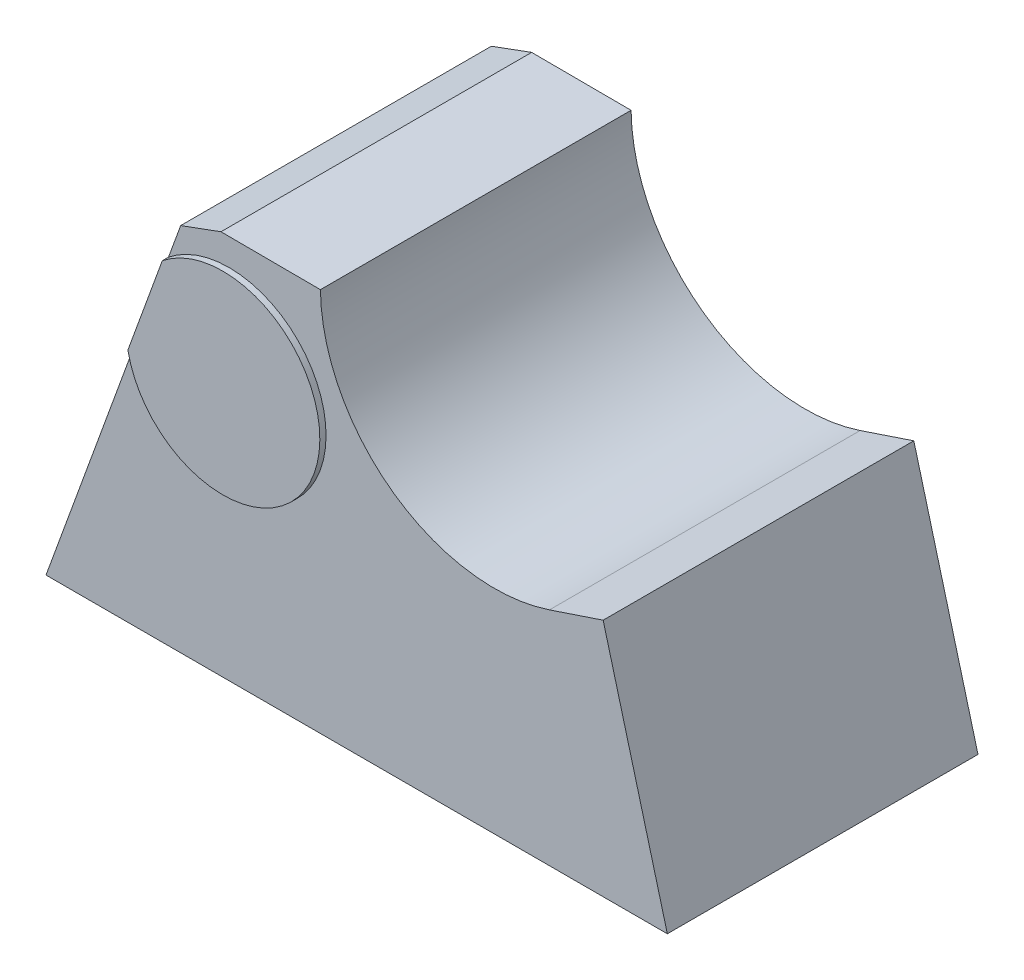
ISO-10303-21;
HEADER;
FILE_DESCRIPTION(('STEP AP214'),'2;1');
FILE_NAME('part.step','',(''),(''),'','','');
FILE_SCHEMA(('AUTOMOTIVE_DESIGN { 1 0 10303 214 1 1 1 1 }'));
ENDSEC;
DATA;
#1=APPLICATION_CONTEXT('core data for automotive mechanical design processes');
#2=APPLICATION_PROTOCOL_DEFINITION('international standard','automotive_design',2000,#1);
#3=PRODUCT_CONTEXT('',#1,'mechanical');
#4=PRODUCT('Part','Part','',(#3));
#5=PRODUCT_RELATED_PRODUCT_CATEGORY('part','',(#4));
#6=PRODUCT_DEFINITION_FORMATION('','',#4);
#7=PRODUCT_DEFINITION_CONTEXT('part definition',#1,'design');
#8=PRODUCT_DEFINITION('design','',#6,#7);
#9=PRODUCT_DEFINITION_SHAPE('','',#8);
#10=(LENGTH_UNIT() NAMED_UNIT(*) SI_UNIT(.MILLI.,.METRE.));
#11=(NAMED_UNIT(*) PLANE_ANGLE_UNIT() SI_UNIT($,.RADIAN.));
#12=(NAMED_UNIT(*) SI_UNIT($,.STERADIAN.) SOLID_ANGLE_UNIT());
#13=UNCERTAINTY_MEASURE_WITH_UNIT(LENGTH_MEASURE(1.E-05),#10,'distance_accuracy_value','');
#14=(GEOMETRIC_REPRESENTATION_CONTEXT(3) GLOBAL_UNCERTAINTY_ASSIGNED_CONTEXT((#13)) GLOBAL_UNIT_ASSIGNED_CONTEXT((#10,
#11,#12)) REPRESENTATION_CONTEXT('',''));
#15=CARTESIAN_POINT('',(0.,0.,0.));
#16=DIRECTION('',(0.,0.,1.));
#17=DIRECTION('',(1.,0.,0.));
#18=AXIS2_PLACEMENT_3D('',#15,#16,#17);
#19=CARTESIAN_POINT('',(360.804093968481,53.1162684441263,0.));
#20=DIRECTION('',(0.,0.,-1.));
#21=DIRECTION('',(-1.,0.,0.));
#22=AXIS2_PLACEMENT_3D('',#19,#20,#21);
#23=PLANE('',#22);
#24=DIRECTION('',(0.34202014332567,0.939692620785908,0.));
#25=VECTOR('',#24,1.);
#26=CARTESIAN_POINT('',(142.196902628573,132.68277908839,0.));
#27=LINE('',#26,#25);
#28=CARTESIAN_POINT('',(0.,-258.,0.));
#29=VERTEX_POINT('',#28);
#30=CARTESIAN_POINT('',(70.877250349026,-63.2663551130197,0.));
#31=VERTEX_POINT('',#30);
#32=EDGE_CURVE('E136',#29,#31,#27,.T.);
#33=ORIENTED_EDGE('',*,*,#32,.F.);
#34=DIRECTION('',(1.,0.,0.));
#35=VECTOR('',#34,1.);
#36=CARTESIAN_POINT('',(0.,-258.,0.));
#37=LINE('',#36,#35);
#38=CARTESIAN_POINT('',(500.,-258.,0.));
#39=VERTEX_POINT('',#38);
#40=EDGE_CURVE('E150',#29,#39,#37,.T.);
#41=ORIENTED_EDGE('',*,*,#40,.T.);
#42=DIRECTION('',(-0.258819045102521,0.965925826289068,0.));
#43=VECTOR('',#42,1.);
#44=CARTESIAN_POINT('',(412.896575236252,67.0744067315589,0.));
#45=LINE('',#44,#43);
#46=CARTESIAN_POINT('',(448.352137529273,-65.2475531569163,0.));
#47=VERTEX_POINT('',#46);
#48=EDGE_CURVE('E194',#39,#47,#45,.T.);
#49=ORIENTED_EDGE('',*,*,#48,.T.);
#50=DIRECTION('',(-0.948509060315187,-0.31675,0.));
#51=VECTOR('',#50,1.);
#52=CARTESIAN_POINT('',(500.,-48.,0.));
#53=LINE('',#52,#51);
#54=CARTESIAN_POINT('',(405.149093968481,-79.675,0.));
#55=VERTEX_POINT('',#54);
#56=EDGE_CURVE('E158',#47,#55,#53,.T.);
#57=ORIENTED_EDGE('',*,*,#56,.T.);
#58=CARTESIAN_POINT('',(360.804093968481,53.1162684441263,0.));
#59=DIRECTION('',(0.,0.,-1.));
#60=DIRECTION('',(-1.,0.,0.));
#61=AXIS2_PLACEMENT_3D('',#58,#59,#60);
#62=CIRCLE('',#61,140.);
#63=CARTESIAN_POINT('',(220.815553875511,51.325,0.));
#64=VERTEX_POINT('',#63);
#65=EDGE_CURVE('E161',#55,#64,#62,.T.);
#66=ORIENTED_EDGE('',*,*,#65,.T.);
#67=DIRECTION('',(-0.99999018839045,0.00442979941225365,0.));
#68=VECTOR('',#67,1.);
#69=CARTESIAN_POINT('',(220.815553875511,51.325,0.));
#70=LINE('',#69,#68);
#71=CARTESIAN_POINT('',(140.816338804275,51.6793839529803,0.));
#72=VERTEX_POINT('',#71);
#73=EDGE_CURVE('E170',#64,#72,#70,.T.);
#74=ORIENTED_EDGE('',*,*,#73,.T.);
#75=DIRECTION('',(-0.938775592028502,-0.344529226353202,0.));
#76=VECTOR('',#75,1.);
#77=CARTESIAN_POINT('',(140.816338804275,51.6793839529803,0.));
#78=LINE('',#77,#76);
#79=CARTESIAN_POINT('',(108.381551710386,39.7758660097388,0.));
#80=VERTEX_POINT('',#79);
#81=EDGE_CURVE('E159',#72,#80,#78,.T.);
#82=ORIENTED_EDGE('',*,*,#81,.T.);
#83=CARTESIAN_POINT('',(98.5951281439417,12.8878882437137,0.));
#84=VERTEX_POINT('',#83);
#85=EDGE_CURVE('E154',#84,#80,#27,.T.);
#86=ORIENTED_EDGE('',*,*,#85,.F.);
#87=CARTESIAN_POINT('',(147.365575325694,-47.9844657578517,0.));
#88=DIRECTION('',(0.,0.,-1.));
#89=DIRECTION('',(-1.,0.,0.));
#90=AXIS2_PLACEMENT_3D('',#87,#88,#89);
#91=CIRCLE('',#90,78.);
#92=EDGE_CURVE('E153',#31,#84,#91,.F.);
#93=ORIENTED_EDGE('',*,*,#92,.F.);
#94=EDGE_LOOP('',(#33,#41,#49,#57,#66,#74,#82,#86,#93));
#95=FACE_BOUND('',#94,.T.);
#96=ADVANCED_FACE('F39',(#95),#23,.F.);
#97=CARTESIAN_POINT('',(140.816338804275,51.6793839529803,-250.));
#98=DIRECTION('',(-0.344529226353202,0.938775592028502,0.));
#99=DIRECTION('',(-0.938775592028502,-0.344529226353202,0.));
#100=AXIS2_PLACEMENT_3D('',#97,#98,#99);
#101=PLANE('',#100);
#102=DIRECTION('',(-0.938775592028502,-0.344529226353202,0.));
#103=VECTOR('',#102,1.);
#104=CARTESIAN_POINT('',(140.816338804275,51.6793839529803,-250.));
#105=LINE('',#104,#103);
#106=CARTESIAN_POINT('',(140.816338804275,51.6793839529803,-250.));
#107=VERTEX_POINT('',#106);
#108=CARTESIAN_POINT('',(108.381551710386,39.7758660097388,-250.));
#109=VERTEX_POINT('',#108);
#110=EDGE_CURVE('E173',#107,#109,#105,.T.);
#111=ORIENTED_EDGE('',*,*,#110,.T.);
#112=DIRECTION('',(0.,0.,-1.));
#113=VECTOR('',#112,1.);
#114=CARTESIAN_POINT('',(108.381551710386,39.7758660097388,8.00000000000001));
#115=LINE('',#114,#113);
#116=EDGE_CURVE('E256',#80,#109,#115,.T.);
#117=ORIENTED_EDGE('',*,*,#116,.F.);
#118=ORIENTED_EDGE('',*,*,#81,.F.);
#119=DIRECTION('',(0.,0.,1.));
#120=VECTOR('',#119,1.);
#121=CARTESIAN_POINT('',(140.816338804275,51.6793839529803,-250.));
#122=LINE('',#121,#120);
#123=EDGE_CURVE('E174',#107,#72,#122,.T.);
#124=ORIENTED_EDGE('',*,*,#123,.F.);
#125=EDGE_LOOP('',(#111,#117,#118,#124));
#126=FACE_BOUND('',#125,.T.);
#127=ADVANCED_FACE('F41',(#126),#101,.T.);
#128=CARTESIAN_POINT('',(360.804093968481,53.1162684441263,-250.));
#129=DIRECTION('',(0.,0.,-1.));
#130=DIRECTION('',(-1.,0.,0.));
#131=AXIS2_PLACEMENT_3D('',#128,#129,#130);
#132=PLANE('',#131);
#133=DIRECTION('',(0.,1.,0.));
#134=VECTOR('',#133,1.);
#135=CARTESIAN_POINT('',(217.527096563025,0.,-250.));
#136=LINE('',#135,#134);
#137=CARTESIAN_POINT('',(217.527096563025,-242.265748937607,-250.));
#138=VERTEX_POINT('',#137);
#139=CARTESIAN_POINT('',(217.527096563025,-122.265748937607,-250.));
#140=VERTEX_POINT('',#139);
#141=EDGE_CURVE('E240',#138,#140,#136,.T.);
#142=ORIENTED_EDGE('',*,*,#141,.T.);
#143=DIRECTION('',(1.,0.,0.));
#144=VECTOR('',#143,1.);
#145=CARTESIAN_POINT('',(0.,-122.265748937607,-250.));
#146=LINE('',#145,#144);
#147=CARTESIAN_POINT('',(77.2040540883632,-122.265748937607,-250.));
#148=VERTEX_POINT('',#147);
#149=EDGE_CURVE('E232',#148,#140,#146,.T.);
#150=ORIENTED_EDGE('',*,*,#149,.F.);
#151=DIRECTION('',(0.,1.,0.));
#152=VECTOR('',#151,1.);
#153=CARTESIAN_POINT('',(77.2040540883632,0.,-250.));
#154=LINE('',#153,#152);
#155=CARTESIAN_POINT('',(77.2040540883632,-242.265748937607,-250.));
#156=VERTEX_POINT('',#155);
#157=EDGE_CURVE('E235',#156,#148,#154,.T.);
#158=ORIENTED_EDGE('',*,*,#157,.F.);
#159=DIRECTION('',(1.,0.,0.));
#160=VECTOR('',#159,1.);
#161=CARTESIAN_POINT('',(0.,-242.265748937607,-250.));
#162=LINE('',#161,#160);
#163=EDGE_CURVE('E237',#156,#138,#162,.T.);
#164=ORIENTED_EDGE('',*,*,#163,.T.);
#165=EDGE_LOOP('',(#142,#150,#158,#164));
#166=FACE_BOUND('',#165,.T.);
#167=CARTESIAN_POINT('',(147.365575325694,-47.9844657578517,-250.));
#168=DIRECTION('',(0.,0.,-1.));
#169=DIRECTION('',(-1.,0.,0.));
#170=AXIS2_PLACEMENT_3D('',#167,#168,#169);
#171=CIRCLE('',#170,56.);
#172=CARTESIAN_POINT('',(91.3655753256942,-47.9844657578517,-250.));
#173=VERTEX_POINT('',#172);
#174=EDGE_CURVE('E219',#173,#173,#171,.T.);
#175=ORIENTED_EDGE('',*,*,#174,.F.);
#176=EDGE_LOOP('',(#175));
#177=FACE_BOUND('',#176,.T.);
#178=DIRECTION('',(1.,0.,0.));
#179=VECTOR('',#178,1.);
#180=CARTESIAN_POINT('',(0.,-258.,-250.));
#181=LINE('',#180,#179);
#182=CARTESIAN_POINT('',(0.,-258.,-250.));
#183=VERTEX_POINT('',#182);
#184=CARTESIAN_POINT('',(500.,-258.,-250.));
#185=VERTEX_POINT('',#184);
#186=EDGE_CURVE('E201',#183,#185,#181,.T.);
#187=ORIENTED_EDGE('',*,*,#186,.F.);
#188=DIRECTION('',(0.34202014332567,0.939692620785908,0.));
#189=VECTOR('',#188,1.);
#190=CARTESIAN_POINT('',(142.196902628573,132.68277908839,-250.));
#191=LINE('',#190,#189);
#192=EDGE_CURVE('E138',#183,#109,#191,.T.);
#193=ORIENTED_EDGE('',*,*,#192,.T.);
#194=ORIENTED_EDGE('',*,*,#110,.F.);
#195=DIRECTION('',(-0.99999018839045,0.00442979941225365,0.));
#196=VECTOR('',#195,1.);
#197=CARTESIAN_POINT('',(220.815553875511,51.325,-250.));
#198=LINE('',#197,#196);
#199=CARTESIAN_POINT('',(220.815553875511,51.325,-250.));
#200=VERTEX_POINT('',#199);
#201=EDGE_CURVE('E144',#200,#107,#198,.T.);
#202=ORIENTED_EDGE('',*,*,#201,.F.);
#203=CARTESIAN_POINT('',(360.804093968481,53.1162684441263,-250.));
#204=DIRECTION('',(0.,0.,-1.));
#205=DIRECTION('',(-1.,0.,0.));
#206=AXIS2_PLACEMENT_3D('',#203,#204,#205);
#207=CIRCLE('',#206,140.);
#208=CARTESIAN_POINT('',(405.149093968481,-79.675,-250.));
#209=VERTEX_POINT('',#208);
#210=EDGE_CURVE('E200',#209,#200,#207,.T.);
#211=ORIENTED_EDGE('',*,*,#210,.F.);
#212=DIRECTION('',(-0.948509060315187,-0.31675,0.));
#213=VECTOR('',#212,1.);
#214=CARTESIAN_POINT('',(500.,-48.,-250.));
#215=LINE('',#214,#213);
#216=CARTESIAN_POINT('',(448.352137529273,-65.2475531569163,-250.));
#217=VERTEX_POINT('',#216);
#218=EDGE_CURVE('E192',#217,#209,#215,.T.);
#219=ORIENTED_EDGE('',*,*,#218,.F.);
#220=DIRECTION('',(-0.258819045102521,0.965925826289068,0.));
#221=VECTOR('',#220,1.);
#222=CARTESIAN_POINT('',(412.896575236252,67.0744067315589,-250.));
#223=LINE('',#222,#221);
#224=EDGE_CURVE('E47',#185,#217,#223,.T.);
#225=ORIENTED_EDGE('',*,*,#224,.F.);
#226=EDGE_LOOP('',(#187,#193,#194,#202,#211,#219,#225));
#227=FACE_BOUND('',#226,.T.);
#228=ADVANCED_FACE('F197',(#166,#177,#227),#132,.T.);
#229=CARTESIAN_POINT('',(147.365575325694,-47.9844657578517,5.));
#230=DIRECTION('',(0.,0.,-1.));
#231=DIRECTION('',(-1.,0.,0.));
#232=AXIS2_PLACEMENT_3D('',#229,#230,#231);
#233=CYLINDRICAL_SURFACE('',#232,78.);
#234=DIRECTION('',(0.,0.,-1.));
#235=VECTOR('',#234,1.);
#236=CARTESIAN_POINT('',(98.5951281439417,12.8878882437137,5.));
#237=LINE('',#236,#235);
#238=CARTESIAN_POINT('',(98.5951281439416,12.8878882437137,5.));
#239=VERTEX_POINT('',#238);
#240=EDGE_CURVE('E253',#239,#84,#237,.T.);
#241=ORIENTED_EDGE('',*,*,#240,.F.);
#242=CARTESIAN_POINT('',(147.365575325694,-47.9844657578517,5.));
#243=DIRECTION('',(0.,0.,1.));
#244=DIRECTION('',(1.,0.,0.));
#245=AXIS2_PLACEMENT_3D('',#242,#243,#244);
#246=CIRCLE('',#245,78.);
#247=CARTESIAN_POINT('',(70.877250349026,-63.2663551130196,5.));
#248=VERTEX_POINT('',#247);
#249=EDGE_CURVE('E164',#248,#239,#246,.T.);
#250=ORIENTED_EDGE('',*,*,#249,.F.);
#251=DIRECTION('',(0.,0.,-1.));
#252=VECTOR('',#251,1.);
#253=CARTESIAN_POINT('',(70.877250349026,-63.2663551130197,5.));
#254=LINE('',#253,#252);
#255=EDGE_CURVE('E54',#31,#248,#254,.F.);
#256=ORIENTED_EDGE('',*,*,#255,.F.);
#257=ORIENTED_EDGE('',*,*,#92,.T.);
#258=EDGE_LOOP('',(#241,#250,#256,#257));
#259=FACE_BOUND('',#258,.T.);
#260=ADVANCED_FACE('F277',(#259),#233,.T.);
#261=CARTESIAN_POINT('',(0.,0.,5.));
#262=DIRECTION('',(0.,0.,1.));
#263=DIRECTION('',(1.,0.,0.));
#264=AXIS2_PLACEMENT_3D('',#261,#262,#263);
#265=PLANE('',#264);
#266=ORIENTED_EDGE('',*,*,#249,.T.);
#267=DIRECTION('',(-0.34202014332567,-0.939692620785908,0.));
#268=VECTOR('',#267,1.);
#269=CARTESIAN_POINT('',(82.9196016495638,-30.180266837652,5.));
#270=LINE('',#269,#268);
#271=EDGE_CURVE('E11',#239,#248,#270,.T.);
#272=ORIENTED_EDGE('',*,*,#271,.T.);
#273=EDGE_LOOP('',(#266,#272));
#274=FACE_BOUND('',#273,.T.);
#275=ADVANCED_FACE('F267',(#274),#265,.T.);
#276=CARTESIAN_POINT('',(220.815553875511,51.325,-250.));
#277=DIRECTION('',(0.00442979941225365,0.99999018839045,0.));
#278=DIRECTION('',(-0.99999018839045,0.00442979941225365,0.));
#279=AXIS2_PLACEMENT_3D('',#276,#277,#278);
#280=PLANE('',#279);
#281=ORIENTED_EDGE('',*,*,#73,.F.);
#282=DIRECTION('',(0.,0.,1.));
#283=VECTOR('',#282,1.);
#284=CARTESIAN_POINT('',(220.815553875511,51.325,-250.));
#285=LINE('',#284,#283);
#286=EDGE_CURVE('E176',#200,#64,#285,.T.);
#287=ORIENTED_EDGE('',*,*,#286,.F.);
#288=ORIENTED_EDGE('',*,*,#201,.T.);
#289=ORIENTED_EDGE('',*,*,#123,.T.);
#290=EDGE_LOOP('',(#281,#287,#288,#289));
#291=FACE_BOUND('',#290,.T.);
#292=ADVANCED_FACE('F209',(#291),#280,.T.);
#293=CARTESIAN_POINT('',(360.804093968481,53.1162684441263,-250.));
#294=DIRECTION('',(0.,0.,1.));
#295=DIRECTION('',(1.,0.,0.));
#296=AXIS2_PLACEMENT_3D('',#293,#294,#295);
#297=CYLINDRICAL_SURFACE('',#296,140.);
#298=ORIENTED_EDGE('',*,*,#65,.F.);
#299=DIRECTION('',(0.,0.,1.));
#300=VECTOR('',#299,1.);
#301=CARTESIAN_POINT('',(405.149093968481,-79.675,-250.));
#302=LINE('',#301,#300);
#303=EDGE_CURVE('E178',#209,#55,#302,.T.);
#304=ORIENTED_EDGE('',*,*,#303,.F.);
#305=ORIENTED_EDGE('',*,*,#210,.T.);
#306=ORIENTED_EDGE('',*,*,#286,.T.);
#307=EDGE_LOOP('',(#298,#304,#305,#306));
#308=FACE_BOUND('',#307,.T.);
#309=ADVANCED_FACE('F259',(#308),#297,.F.);
#310=CARTESIAN_POINT('',(500.,-48.,-250.));
#311=DIRECTION('',(-0.31675,0.948509060315188,0.));
#312=DIRECTION('',(-0.948509060315188,-0.31675,0.));
#313=AXIS2_PLACEMENT_3D('',#310,#311,#312);
#314=PLANE('',#313);
#315=DIRECTION('',(0.,0.,-1.));
#316=VECTOR('',#315,1.);
#317=CARTESIAN_POINT('',(448.352137529273,-65.2475531569163,8.00000000000001));
#318=LINE('',#317,#316);
#319=EDGE_CURVE('E186',#47,#217,#318,.T.);
#320=ORIENTED_EDGE('',*,*,#319,.T.);
#321=ORIENTED_EDGE('',*,*,#218,.T.);
#322=ORIENTED_EDGE('',*,*,#303,.T.);
#323=ORIENTED_EDGE('',*,*,#56,.F.);
#324=EDGE_LOOP('',(#320,#321,#322,#323));
#325=FACE_BOUND('',#324,.T.);
#326=ADVANCED_FACE('F191',(#325),#314,.T.);
#327=CARTESIAN_POINT('',(0.,-258.,-250.));
#328=DIRECTION('',(0.,-1.,0.));
#329=DIRECTION('',(0.,0.,-1.));
#330=AXIS2_PLACEMENT_3D('',#327,#328,#329);
#331=PLANE('',#330);
#332=ORIENTED_EDGE('',*,*,#40,.F.);
#333=DIRECTION('',(0.,0.,1.));
#334=VECTOR('',#333,1.);
#335=CARTESIAN_POINT('',(0.,-258.,-250.));
#336=LINE('',#335,#334);
#337=EDGE_CURVE('E133',#183,#29,#336,.T.);
#338=ORIENTED_EDGE('',*,*,#337,.F.);
#339=ORIENTED_EDGE('',*,*,#186,.T.);
#340=DIRECTION('',(0.,0.,1.));
#341=VECTOR('',#340,1.);
#342=CARTESIAN_POINT('',(500.,-258.,-250.));
#343=LINE('',#342,#341);
#344=EDGE_CURVE('E143',#185,#39,#343,.T.);
#345=ORIENTED_EDGE('',*,*,#344,.T.);
#346=EDGE_LOOP('',(#332,#338,#339,#345));
#347=FACE_BOUND('',#346,.T.);
#348=ADVANCED_FACE('F157',(#347),#331,.T.);
#349=CARTESIAN_POINT('',(147.365575325694,-47.9844657578517,-255.));
#350=DIRECTION('',(0.,0.,1.));
#351=DIRECTION('',(1.,0.,0.));
#352=AXIS2_PLACEMENT_3D('',#349,#350,#351);
#353=CYLINDRICAL_SURFACE('',#352,56.);
#354=CARTESIAN_POINT('',(147.365575325694,-47.9844657578517,-255.));
#355=DIRECTION('',(0.,0.,-1.));
#356=DIRECTION('',(-1.,0.,0.));
#357=AXIS2_PLACEMENT_3D('',#354,#355,#356);
#358=CIRCLE('',#357,56.);
#359=CARTESIAN_POINT('',(91.3655753256942,-47.9844657578517,-255.));
#360=VERTEX_POINT('',#359);
#361=EDGE_CURVE('E218',#360,#360,#358,.T.);
#362=ORIENTED_EDGE('',*,*,#361,.F.);
#363=EDGE_LOOP('',(#362));
#364=FACE_BOUND('',#363,.T.);
#365=ORIENTED_EDGE('',*,*,#174,.T.);
#366=EDGE_LOOP('',(#365));
#367=FACE_BOUND('',#366,.T.);
#368=ADVANCED_FACE('F285',(#364,#367),#353,.T.);
#369=CARTESIAN_POINT('',(0.,0.,-255.));
#370=DIRECTION('',(0.,0.,-1.));
#371=DIRECTION('',(-1.,0.,0.));
#372=AXIS2_PLACEMENT_3D('',#369,#370,#371);
#373=PLANE('',#372);
#374=ORIENTED_EDGE('',*,*,#361,.T.);
#375=EDGE_LOOP('',(#374));
#376=FACE_BOUND('',#375,.T.);
#377=ADVANCED_FACE('F288',(#376),#373,.T.);
#378=CARTESIAN_POINT('',(217.527096563025,0.,-258.));
#379=DIRECTION('',(1.,0.,0.));
#380=DIRECTION('',(0.,0.,-1.));
#381=AXIS2_PLACEMENT_3D('',#378,#379,#380);
#382=PLANE('',#381);
#383=ORIENTED_EDGE('',*,*,#141,.F.);
#384=DIRECTION('',(0.,0.,1.));
#385=VECTOR('',#384,1.);
#386=CARTESIAN_POINT('',(217.527096563025,-242.265748937607,-258.));
#387=LINE('',#386,#385);
#388=CARTESIAN_POINT('',(217.527096563025,-242.265748937607,-258.));
#389=VERTEX_POINT('',#388);
#390=EDGE_CURVE('E222',#389,#138,#387,.T.);
#391=ORIENTED_EDGE('',*,*,#390,.F.);
#392=DIRECTION('',(0.,1.,0.));
#393=VECTOR('',#392,1.);
#394=CARTESIAN_POINT('',(217.527096563025,0.,-258.));
#395=LINE('',#394,#393);
#396=CARTESIAN_POINT('',(217.527096563025,-122.265748937607,-258.));
#397=VERTEX_POINT('',#396);
#398=EDGE_CURVE('E234',#389,#397,#395,.T.);
#399=ORIENTED_EDGE('',*,*,#398,.T.);
#400=DIRECTION('',(0.,0.,1.));
#401=VECTOR('',#400,1.);
#402=CARTESIAN_POINT('',(217.527096563025,-122.265748937607,-258.));
#403=LINE('',#402,#401);
#404=EDGE_CURVE('E229',#397,#140,#403,.T.);
#405=ORIENTED_EDGE('',*,*,#404,.T.);
#406=EDGE_LOOP('',(#383,#391,#399,#405));
#407=FACE_BOUND('',#406,.T.);
#408=ADVANCED_FACE('F292',(#407),#382,.T.);
#409=CARTESIAN_POINT('',(0.,-242.265748937607,-258.));
#410=DIRECTION('',(0.,-1.,0.));
#411=DIRECTION('',(0.,0.,-1.));
#412=AXIS2_PLACEMENT_3D('',#409,#410,#411);
#413=PLANE('',#412);
#414=ORIENTED_EDGE('',*,*,#163,.F.);
#415=DIRECTION('',(0.,0.,1.));
#416=VECTOR('',#415,1.);
#417=CARTESIAN_POINT('',(77.2040540883632,-242.265748937607,-258.));
#418=LINE('',#417,#416);
#419=CARTESIAN_POINT('',(77.2040540883632,-242.265748937607,-258.));
#420=VERTEX_POINT('',#419);
#421=EDGE_CURVE('E226',#420,#156,#418,.T.);
#422=ORIENTED_EDGE('',*,*,#421,.F.);
#423=DIRECTION('',(1.,0.,0.));
#424=VECTOR('',#423,1.);
#425=CARTESIAN_POINT('',(0.,-242.265748937607,-258.));
#426=LINE('',#425,#424);
#427=EDGE_CURVE('E246',#420,#389,#426,.T.);
#428=ORIENTED_EDGE('',*,*,#427,.T.);
#429=ORIENTED_EDGE('',*,*,#390,.T.);
#430=EDGE_LOOP('',(#414,#422,#428,#429));
#431=FACE_BOUND('',#430,.T.);
#432=ADVANCED_FACE('F296',(#431),#413,.T.);
#433=CARTESIAN_POINT('',(77.2040540883632,0.,-258.));
#434=DIRECTION('',(1.,0.,0.));
#435=DIRECTION('',(0.,0.,-1.));
#436=AXIS2_PLACEMENT_3D('',#433,#434,#435);
#437=PLANE('',#436);
#438=ORIENTED_EDGE('',*,*,#157,.T.);
#439=DIRECTION('',(0.,0.,1.));
#440=VECTOR('',#439,1.);
#441=CARTESIAN_POINT('',(77.2040540883632,-122.265748937607,-258.));
#442=LINE('',#441,#440);
#443=CARTESIAN_POINT('',(77.2040540883632,-122.265748937607,-258.));
#444=VERTEX_POINT('',#443);
#445=EDGE_CURVE('E61',#444,#148,#442,.T.);
#446=ORIENTED_EDGE('',*,*,#445,.F.);
#447=DIRECTION('',(0.,1.,0.));
#448=VECTOR('',#447,1.);
#449=CARTESIAN_POINT('',(77.2040540883632,0.,-258.));
#450=LINE('',#449,#448);
#451=EDGE_CURVE('E244',#420,#444,#450,.T.);
#452=ORIENTED_EDGE('',*,*,#451,.F.);
#453=ORIENTED_EDGE('',*,*,#421,.T.);
#454=EDGE_LOOP('',(#438,#446,#452,#453));
#455=FACE_BOUND('',#454,.T.);
#456=ADVANCED_FACE('F300',(#455),#437,.F.);
#457=CARTESIAN_POINT('',(0.,-122.265748937607,-258.));
#458=DIRECTION('',(0.,-1.,0.));
#459=DIRECTION('',(0.,0.,-1.));
#460=AXIS2_PLACEMENT_3D('',#457,#458,#459);
#461=PLANE('',#460);
#462=ORIENTED_EDGE('',*,*,#149,.T.);
#463=ORIENTED_EDGE('',*,*,#404,.F.);
#464=DIRECTION('',(1.,0.,0.));
#465=VECTOR('',#464,1.);
#466=CARTESIAN_POINT('',(0.,-122.265748937607,-258.));
#467=LINE('',#466,#465);
#468=EDGE_CURVE('E231',#444,#397,#467,.T.);
#469=ORIENTED_EDGE('',*,*,#468,.F.);
#470=ORIENTED_EDGE('',*,*,#445,.T.);
#471=EDGE_LOOP('',(#462,#463,#469,#470));
#472=FACE_BOUND('',#471,.T.);
#473=ADVANCED_FACE('F304',(#472),#461,.F.);
#474=CARTESIAN_POINT('',(0.,0.,-258.));
#475=DIRECTION('',(0.,0.,-1.));
#476=DIRECTION('',(-1.,0.,0.));
#477=AXIS2_PLACEMENT_3D('',#474,#475,#476);
#478=PLANE('',#477);
#479=ORIENTED_EDGE('',*,*,#398,.F.);
#480=ORIENTED_EDGE('',*,*,#427,.F.);
#481=ORIENTED_EDGE('',*,*,#451,.T.);
#482=ORIENTED_EDGE('',*,*,#468,.T.);
#483=EDGE_LOOP('',(#479,#480,#481,#482));
#484=FACE_BOUND('',#483,.T.);
#485=ADVANCED_FACE('F308',(#484),#478,.T.);
#486=CARTESIAN_POINT('',(402.006350946109,107.717277088193,8.00000000000001));
#487=DIRECTION('',(-0.965925826289068,-0.258819045102521,0.));
#488=DIRECTION('',(0.258819045102521,-0.965925826289068,0.));
#489=AXIS2_PLACEMENT_3D('',#486,#487,#488);
#490=PLANE('',#489);
#491=ORIENTED_EDGE('',*,*,#344,.F.);
#492=ORIENTED_EDGE('',*,*,#224,.T.);
#493=ORIENTED_EDGE('',*,*,#319,.F.);
#494=ORIENTED_EDGE('',*,*,#48,.F.);
#495=EDGE_LOOP('',(#491,#492,#493,#494));
#496=FACE_BOUND('',#495,.T.);
#497=ADVANCED_FACE('F185',(#496),#490,.F.);
#498=CARTESIAN_POINT('',(82.9196016495638,-30.180266837652,8.00000000000001));
#499=DIRECTION('',(-0.939692620785908,0.34202014332567,0.));
#500=DIRECTION('',(-0.34202014332567,-0.939692620785908,0.));
#501=AXIS2_PLACEMENT_3D('',#498,#499,#500);
#502=PLANE('',#501);
#503=ORIENTED_EDGE('',*,*,#337,.T.);
#504=ORIENTED_EDGE('',*,*,#32,.T.);
#505=ORIENTED_EDGE('',*,*,#255,.T.);
#506=ORIENTED_EDGE('',*,*,#271,.F.);
#507=ORIENTED_EDGE('',*,*,#240,.T.);
#508=ORIENTED_EDGE('',*,*,#85,.T.);
#509=ORIENTED_EDGE('',*,*,#116,.T.);
#510=ORIENTED_EDGE('',*,*,#192,.F.);
#511=EDGE_LOOP('',(#503,#504,#505,#506,#507,#508,#509,#510));
#512=FACE_BOUND('',#511,.T.);
#513=ADVANCED_FACE('F135',(#512),#502,.T.);
#514=CLOSED_SHELL('',(#96,#127,#228,#260,#275,#292,#309,#326,#348,#368,#377,#408,#432,#456,#473,
#485,#497,#513));
#515=MANIFOLD_SOLID_BREP('B2',#514);
#516=ADVANCED_BREP_SHAPE_REPRESENTATION('',(#18,#515),#14);
#517=SHAPE_DEFINITION_REPRESENTATION(#9,#516);
ENDSEC;
END-ISO-10303-21;
